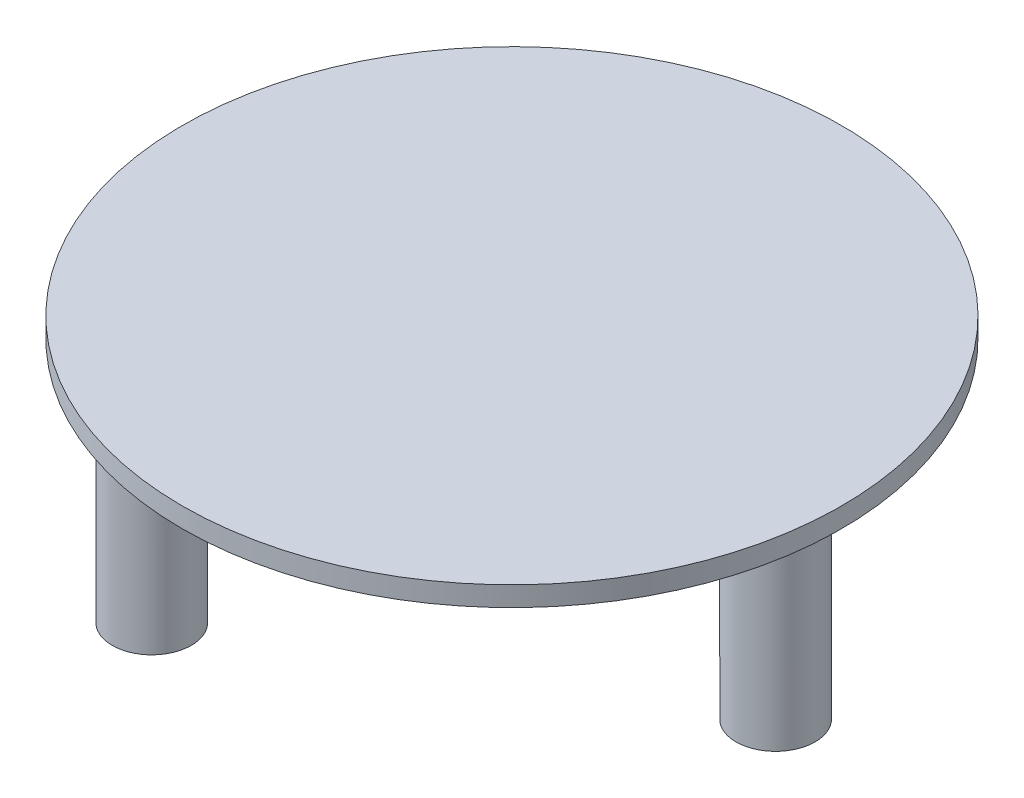
ISO-10303-21;
HEADER;
FILE_DESCRIPTION(('STEP AP214'),'2;1');
FILE_NAME('part.step','',(''),(''),'','','');
FILE_SCHEMA(('AUTOMOTIVE_DESIGN { 1 0 10303 214 1 1 1 1 }'));
ENDSEC;
DATA;
#1=APPLICATION_CONTEXT('core data for automotive mechanical design processes');
#2=APPLICATION_PROTOCOL_DEFINITION('international standard','automotive_design',2000,#1);
#3=PRODUCT_CONTEXT('',#1,'mechanical');
#4=PRODUCT('Part','Part','',(#3));
#5=PRODUCT_RELATED_PRODUCT_CATEGORY('part','',(#4));
#6=PRODUCT_DEFINITION_FORMATION('','',#4);
#7=PRODUCT_DEFINITION_CONTEXT('part definition',#1,'design');
#8=PRODUCT_DEFINITION('design','',#6,#7);
#9=PRODUCT_DEFINITION_SHAPE('','',#8);
#10=(LENGTH_UNIT() NAMED_UNIT(*) SI_UNIT(.MILLI.,.METRE.));
#11=(NAMED_UNIT(*) PLANE_ANGLE_UNIT() SI_UNIT($,.RADIAN.));
#12=(NAMED_UNIT(*) SI_UNIT($,.STERADIAN.) SOLID_ANGLE_UNIT());
#13=UNCERTAINTY_MEASURE_WITH_UNIT(LENGTH_MEASURE(1.E-05),#10,'distance_accuracy_value','');
#14=(GEOMETRIC_REPRESENTATION_CONTEXT(3) GLOBAL_UNCERTAINTY_ASSIGNED_CONTEXT((#13)) GLOBAL_UNIT_ASSIGNED_CONTEXT((#10,
#11,#12)) REPRESENTATION_CONTEXT('',''));
#15=CARTESIAN_POINT('',(0.,0.,0.));
#16=DIRECTION('',(0.,0.,1.));
#17=DIRECTION('',(1.,0.,0.));
#18=AXIS2_PLACEMENT_3D('',#15,#16,#17);
#19=CARTESIAN_POINT('',(0.,15.,0.));
#20=DIRECTION('',(0.,-1.,0.));
#21=DIRECTION('',(0.,0.,-1.));
#22=AXIS2_PLACEMENT_3D('',#19,#20,#21);
#23=CYLINDRICAL_SURFACE('',#22,250.);
#24=CARTESIAN_POINT('',(0.,15.,0.));
#25=DIRECTION('',(0.,1.,0.));
#26=DIRECTION('',(0.,0.,1.));
#27=AXIS2_PLACEMENT_3D('',#24,#25,#26);
#28=CIRCLE('',#27,250.);
#29=CARTESIAN_POINT('',(0.,15.,250.));
#30=VERTEX_POINT('',#29);
#31=EDGE_CURVE('E53',#30,#30,#28,.T.);
#32=ORIENTED_EDGE('',*,*,#31,.F.);
#33=EDGE_LOOP('',(#32));
#34=FACE_BOUND('',#33,.T.);
#35=CARTESIAN_POINT('',(0.,0.,0.));
#36=DIRECTION('',(0.,1.,0.));
#37=DIRECTION('',(0.,0.,1.));
#38=AXIS2_PLACEMENT_3D('',#35,#36,#37);
#39=CIRCLE('',#38,250.);
#40=CARTESIAN_POINT('',(0.,0.,250.));
#41=VERTEX_POINT('',#40);
#42=EDGE_CURVE('E56',#41,#41,#39,.T.);
#43=ORIENTED_EDGE('',*,*,#42,.T.);
#44=EDGE_LOOP('',(#43));
#45=FACE_BOUND('',#44,.T.);
#46=ADVANCED_FACE('F39',(#34,#45),#23,.T.);
#47=CARTESIAN_POINT('',(0.,15.,0.));
#48=DIRECTION('',(0.,1.,0.));
#49=DIRECTION('',(0.,0.,1.));
#50=AXIS2_PLACEMENT_3D('',#47,#48,#49);
#51=PLANE('',#50);
#52=ORIENTED_EDGE('',*,*,#31,.T.);
#53=EDGE_LOOP('',(#52));
#54=FACE_BOUND('',#53,.T.);
#55=ADVANCED_FACE('F86',(#54),#51,.T.);
#56=CARTESIAN_POINT('',(0.,0.,0.));
#57=DIRECTION('',(0.,1.,0.));
#58=DIRECTION('',(0.,0.,1.));
#59=AXIS2_PLACEMENT_3D('',#56,#57,#58);
#60=PLANE('',#59);
#61=CARTESIAN_POINT('',(-99.9999999999984,0.,-173.205080756889));
#62=DIRECTION('',(0.,1.,0.));
#63=DIRECTION('',(0.,0.,1.));
#64=AXIS2_PLACEMENT_3D('',#61,#62,#63);
#65=CIRCLE('',#64,30.);
#66=CARTESIAN_POINT('',(-99.9999999999984,0.,-143.205080756889));
#67=VERTEX_POINT('',#66);
#68=EDGE_CURVE('E10',#67,#67,#65,.F.);
#69=ORIENTED_EDGE('',*,*,#68,.F.);
#70=EDGE_LOOP('',(#69));
#71=FACE_BOUND('',#70,.T.);
#72=CARTESIAN_POINT('',(-100.000000000001,0.,173.205080756887));
#73=DIRECTION('',(0.,1.,0.));
#74=DIRECTION('',(0.,0.,1.));
#75=AXIS2_PLACEMENT_3D('',#72,#73,#74);
#76=CIRCLE('',#75,30.);
#77=CARTESIAN_POINT('',(-100.000000000001,0.,203.205080756887));
#78=VERTEX_POINT('',#77);
#79=EDGE_CURVE('E45',#78,#78,#76,.F.);
#80=ORIENTED_EDGE('',*,*,#79,.F.);
#81=EDGE_LOOP('',(#80));
#82=FACE_BOUND('',#81,.T.);
#83=CARTESIAN_POINT('',(200.,0.,0.));
#84=DIRECTION('',(0.,1.,0.));
#85=DIRECTION('',(0.,0.,1.));
#86=AXIS2_PLACEMENT_3D('',#83,#84,#85);
#87=CIRCLE('',#86,30.);
#88=CARTESIAN_POINT('',(200.,0.,30.));
#89=VERTEX_POINT('',#88);
#90=EDGE_CURVE('E49',#89,#89,#87,.F.);
#91=ORIENTED_EDGE('',*,*,#90,.F.);
#92=EDGE_LOOP('',(#91));
#93=FACE_BOUND('',#92,.T.);
#94=ORIENTED_EDGE('',*,*,#42,.F.);
#95=EDGE_LOOP('',(#94));
#96=FACE_BOUND('',#95,.T.);
#97=ADVANCED_FACE('F91',(#71,#82,#93,#96),#60,.F.);
#98=CARTESIAN_POINT('',(200.,-150.,0.));
#99=DIRECTION('',(0.,1.,0.));
#100=DIRECTION('',(0.,0.,1.));
#101=AXIS2_PLACEMENT_3D('',#98,#99,#100);
#102=CYLINDRICAL_SURFACE('',#101,30.);
#103=CARTESIAN_POINT('',(200.,-150.,0.));
#104=DIRECTION('',(0.,-1.,0.));
#105=DIRECTION('',(0.,0.,-1.));
#106=AXIS2_PLACEMENT_3D('',#103,#104,#105);
#107=CIRCLE('',#106,30.);
#108=CARTESIAN_POINT('',(200.,-150.,-30.));
#109=VERTEX_POINT('',#108);
#110=EDGE_CURVE('E59',#109,#109,#107,.T.);
#111=ORIENTED_EDGE('',*,*,#110,.F.);
#112=EDGE_LOOP('',(#111));
#113=FACE_BOUND('',#112,.T.);
#114=ORIENTED_EDGE('',*,*,#90,.T.);
#115=EDGE_LOOP('',(#114));
#116=FACE_BOUND('',#115,.T.);
#117=ADVANCED_FACE('F99',(#113,#116),#102,.T.);
#118=CARTESIAN_POINT('',(200.,-150.,0.));
#119=DIRECTION('',(0.,-1.,0.));
#120=DIRECTION('',(0.,0.,-1.));
#121=AXIS2_PLACEMENT_3D('',#118,#119,#120);
#122=PLANE('',#121);
#123=ORIENTED_EDGE('',*,*,#110,.T.);
#124=EDGE_LOOP('',(#123));
#125=FACE_BOUND('',#124,.T.);
#126=ADVANCED_FACE('F104',(#125),#122,.T.);
#127=CARTESIAN_POINT('',(-100.000000000001,-150.,173.205080756887));
#128=DIRECTION('',(0.,1.,0.));
#129=DIRECTION('',(0.,0.,1.));
#130=AXIS2_PLACEMENT_3D('',#127,#128,#129);
#131=CYLINDRICAL_SURFACE('',#130,30.);
#132=CARTESIAN_POINT('',(-100.000000000001,-150.,173.205080756887));
#133=DIRECTION('',(0.,-1.,0.));
#134=DIRECTION('',(0.866025403784436,0.,0.500000000000004));
#135=AXIS2_PLACEMENT_3D('',#132,#133,#134);
#136=CIRCLE('',#135,30.);
#137=CARTESIAN_POINT('',(-74.0192378864677,-150.,188.205080756887));
#138=VERTEX_POINT('',#137);
#139=EDGE_CURVE('E64',#138,#138,#136,.T.);
#140=ORIENTED_EDGE('',*,*,#139,.F.);
#141=EDGE_LOOP('',(#140));
#142=FACE_BOUND('',#141,.T.);
#143=ORIENTED_EDGE('',*,*,#79,.T.);
#144=EDGE_LOOP('',(#143));
#145=FACE_BOUND('',#144,.T.);
#146=ADVANCED_FACE('F82',(#142,#145),#131,.T.);
#147=CARTESIAN_POINT('',(-100.000000000001,-150.,173.205080756887));
#148=DIRECTION('',(0.,-1.,0.));
#149=DIRECTION('',(0.866025403784436,0.,0.500000000000004));
#150=AXIS2_PLACEMENT_3D('',#147,#148,#149);
#151=PLANE('',#150);
#152=ORIENTED_EDGE('',*,*,#139,.T.);
#153=EDGE_LOOP('',(#152));
#154=FACE_BOUND('',#153,.T.);
#155=ADVANCED_FACE('F75',(#154),#151,.T.);
#156=CARTESIAN_POINT('',(-99.9999999999984,-150.,-173.205080756889));
#157=DIRECTION('',(0.,1.,0.));
#158=DIRECTION('',(0.,0.,1.));
#159=AXIS2_PLACEMENT_3D('',#156,#157,#158);
#160=CYLINDRICAL_SURFACE('',#159,30.);
#161=CARTESIAN_POINT('',(-99.9999999999984,-150.,-173.205080756889));
#162=DIRECTION('',(0.,-1.,0.));
#163=DIRECTION('',(-0.866025403784443,0.,0.499999999999992));
#164=AXIS2_PLACEMENT_3D('',#161,#162,#163);
#165=CIRCLE('',#164,30.);
#166=CARTESIAN_POINT('',(-125.980762113532,-150.,-158.205080756889));
#167=VERTEX_POINT('',#166);
#168=EDGE_CURVE('E67',#167,#167,#165,.T.);
#169=ORIENTED_EDGE('',*,*,#168,.F.);
#170=EDGE_LOOP('',(#169));
#171=FACE_BOUND('',#170,.T.);
#172=ORIENTED_EDGE('',*,*,#68,.T.);
#173=EDGE_LOOP('',(#172));
#174=FACE_BOUND('',#173,.T.);
#175=ADVANCED_FACE('F73',(#171,#174),#160,.T.);
#176=CARTESIAN_POINT('',(-99.9999999999984,-150.,-173.205080756889));
#177=DIRECTION('',(0.,-1.,0.));
#178=DIRECTION('',(-0.866025403784443,0.,0.499999999999992));
#179=AXIS2_PLACEMENT_3D('',#176,#177,#178);
#180=PLANE('',#179);
#181=ORIENTED_EDGE('',*,*,#168,.T.);
#182=EDGE_LOOP('',(#181));
#183=FACE_BOUND('',#182,.T.);
#184=ADVANCED_FACE('F71',(#183),#180,.T.);
#185=CLOSED_SHELL('',(#46,#55,#97,#117,#126,#146,#155,#175,#184));
#186=MANIFOLD_SOLID_BREP('B2',#185);
#187=ADVANCED_BREP_SHAPE_REPRESENTATION('',(#18,#186),#14);
#188=SHAPE_DEFINITION_REPRESENTATION(#9,#187);
ENDSEC;
END-ISO-10303-21;
